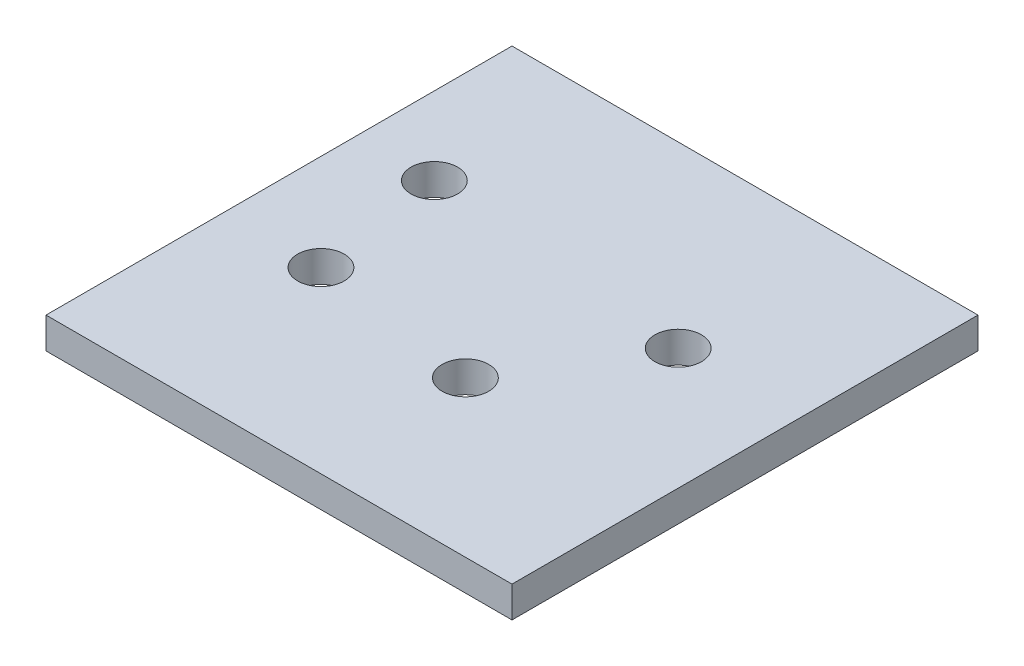
ISO-10303-21;
HEADER;
FILE_DESCRIPTION(('STEP AP214'),'2;1');
FILE_NAME('part.step','',(''),(''),'','','');
FILE_SCHEMA(('AUTOMOTIVE_DESIGN { 1 0 10303 214 1 1 1 1 }'));
ENDSEC;
DATA;
#1=APPLICATION_CONTEXT('core data for automotive mechanical design processes');
#2=APPLICATION_PROTOCOL_DEFINITION('international standard','automotive_design',2000,#1);
#3=PRODUCT_CONTEXT('',#1,'mechanical');
#4=PRODUCT('Part','Part','',(#3));
#5=PRODUCT_RELATED_PRODUCT_CATEGORY('part','',(#4));
#6=PRODUCT_DEFINITION_FORMATION('','',#4);
#7=PRODUCT_DEFINITION_CONTEXT('part definition',#1,'design');
#8=PRODUCT_DEFINITION('design','',#6,#7);
#9=PRODUCT_DEFINITION_SHAPE('','',#8);
#10=(LENGTH_UNIT() NAMED_UNIT(*) SI_UNIT(.MILLI.,.METRE.));
#11=(NAMED_UNIT(*) PLANE_ANGLE_UNIT() SI_UNIT($,.RADIAN.));
#12=(NAMED_UNIT(*) SI_UNIT($,.STERADIAN.) SOLID_ANGLE_UNIT());
#13=UNCERTAINTY_MEASURE_WITH_UNIT(LENGTH_MEASURE(1.E-05),#10,'distance_accuracy_value','');
#14=(GEOMETRIC_REPRESENTATION_CONTEXT(3) GLOBAL_UNCERTAINTY_ASSIGNED_CONTEXT((#13)) GLOBAL_UNIT_ASSIGNED_CONTEXT((#10,
#11,#12)) REPRESENTATION_CONTEXT('',''));
#15=CARTESIAN_POINT('',(0.,0.,0.));
#16=DIRECTION('',(0.,0.,1.));
#17=DIRECTION('',(1.,0.,0.));
#18=AXIS2_PLACEMENT_3D('',#15,#16,#17);
#19=CARTESIAN_POINT('',(0.,2.,0.));
#20=DIRECTION('',(0.,1.,0.));
#21=DIRECTION('',(0.,0.,1.));
#22=AXIS2_PLACEMENT_3D('',#19,#20,#21);
#23=PLANE('',#22);
#24=CARTESIAN_POINT('',(-18.6292997644175,2.,-7.47838875078331));
#25=DIRECTION('',(0.,1.,0.));
#26=DIRECTION('',(0.,0.,1.));
#27=AXIS2_PLACEMENT_3D('',#24,#25,#26);
#28=CIRCLE('',#27,1.5);
#29=CARTESIAN_POINT('',(-18.6292997644175,2.,-5.9783887507833));
#30=VERTEX_POINT('',#29);
#31=EDGE_CURVE('E123',#30,#30,#28,.T.);
#32=ORIENTED_EDGE('',*,*,#31,.F.);
#33=EDGE_LOOP('',(#32));
#34=FACE_BOUND('',#33,.T.);
#35=CARTESIAN_POINT('',(-1.4292997644175,2.,-5.9783887507833));
#36=DIRECTION('',(0.,1.,0.));
#37=DIRECTION('',(0.,0.,1.));
#38=AXIS2_PLACEMENT_3D('',#35,#36,#37);
#39=CIRCLE('',#38,1.5);
#40=CARTESIAN_POINT('',(-1.4292997644175,2.,-4.4783887507833));
#41=VERTEX_POINT('',#40);
#42=EDGE_CURVE('E120',#41,#41,#39,.T.);
#43=ORIENTED_EDGE('',*,*,#42,.F.);
#44=EDGE_LOOP('',(#43));
#45=FACE_BOUND('',#44,.T.);
#46=DIRECTION('',(0.,0.,1.));
#47=VECTOR('',#46,1.);
#48=CARTESIAN_POINT('',(6.3707002355825,2.,0.));
#49=LINE('',#48,#47);
#50=CARTESIAN_POINT('',(6.3707002355825,2.,-17.4783887507833));
#51=VERTEX_POINT('',#50);
#52=CARTESIAN_POINT('',(6.3707002355825,2.,12.5216112492167));
#53=VERTEX_POINT('',#52);
#54=EDGE_CURVE('E113',#51,#53,#49,.T.);
#55=ORIENTED_EDGE('',*,*,#54,.F.);
#56=DIRECTION('',(1.,0.,0.));
#57=VECTOR('',#56,1.);
#58=CARTESIAN_POINT('',(0.,2.,-17.4783887507833));
#59=LINE('',#58,#57);
#60=CARTESIAN_POINT('',(-23.6292997644175,2.,-17.4783887507833));
#61=VERTEX_POINT('',#60);
#62=EDGE_CURVE('E102',#61,#51,#59,.T.);
#63=ORIENTED_EDGE('',*,*,#62,.F.);
#64=DIRECTION('',(0.,0.,1.));
#65=VECTOR('',#64,1.);
#66=CARTESIAN_POINT('',(-23.6292997644175,2.,0.));
#67=LINE('',#66,#65);
#68=CARTESIAN_POINT('',(-23.6292997644175,2.,12.5216112492167));
#69=VERTEX_POINT('',#68);
#70=EDGE_CURVE('E109',#61,#69,#67,.T.);
#71=ORIENTED_EDGE('',*,*,#70,.T.);
#72=DIRECTION('',(1.,0.,0.));
#73=VECTOR('',#72,1.);
#74=CARTESIAN_POINT('',(0.,2.,12.5216112492167));
#75=LINE('',#74,#73);
#76=EDGE_CURVE('E69',#69,#53,#75,.T.);
#77=ORIENTED_EDGE('',*,*,#76,.T.);
#78=EDGE_LOOP('',(#55,#63,#71,#77));
#79=FACE_BOUND('',#78,.T.);
#80=CARTESIAN_POINT('',(-6.6292997644175,2.,2.52161124921669));
#81=DIRECTION('',(0.,1.,0.));
#82=DIRECTION('',(0.,0.,1.));
#83=AXIS2_PLACEMENT_3D('',#80,#81,#82);
#84=CIRCLE('',#83,1.5);
#85=CARTESIAN_POINT('',(-6.6292997644175,2.,4.0216112492167));
#86=VERTEX_POINT('',#85);
#87=EDGE_CURVE('E115',#86,#86,#84,.T.);
#88=ORIENTED_EDGE('',*,*,#87,.F.);
#89=EDGE_LOOP('',(#88));
#90=FACE_BOUND('',#89,.T.);
#91=CARTESIAN_POINT('',(-17.4292997644175,2.,1.02161124921669));
#92=DIRECTION('',(0.,1.,0.));
#93=DIRECTION('',(0.,0.,1.));
#94=AXIS2_PLACEMENT_3D('',#91,#92,#93);
#95=CIRCLE('',#94,1.5);
#96=CARTESIAN_POINT('',(-17.4292997644175,2.,2.5216112492167));
#97=VERTEX_POINT('',#96);
#98=EDGE_CURVE('E130',#97,#97,#95,.T.);
#99=ORIENTED_EDGE('',*,*,#98,.F.);
#100=EDGE_LOOP('',(#99));
#101=FACE_BOUND('',#100,.T.);
#102=ADVANCED_FACE('F52',(#34,#45,#79,#90,#101),#23,.T.);
#103=CARTESIAN_POINT('',(0.,0.,0.));
#104=DIRECTION('',(0.,1.,0.));
#105=DIRECTION('',(0.,0.,1.));
#106=AXIS2_PLACEMENT_3D('',#103,#104,#105);
#107=PLANE('',#106);
#108=CARTESIAN_POINT('',(-6.6292997644175,0.,2.52161124921669));
#109=DIRECTION('',(0.,1.,0.));
#110=DIRECTION('',(0.,0.,1.));
#111=AXIS2_PLACEMENT_3D('',#108,#109,#110);
#112=CIRCLE('',#111,1.5);
#113=CARTESIAN_POINT('',(-6.6292997644175,0.,4.0216112492167));
#114=VERTEX_POINT('',#113);
#115=EDGE_CURVE('E126',#114,#114,#112,.T.);
#116=ORIENTED_EDGE('',*,*,#115,.T.);
#117=EDGE_LOOP('',(#116));
#118=FACE_BOUND('',#117,.T.);
#119=DIRECTION('',(0.,0.,1.));
#120=VECTOR('',#119,1.);
#121=CARTESIAN_POINT('',(6.3707002355825,0.,0.));
#122=LINE('',#121,#120);
#123=CARTESIAN_POINT('',(6.3707002355825,0.,-17.4783887507833));
#124=VERTEX_POINT('',#123);
#125=CARTESIAN_POINT('',(6.3707002355825,0.,12.5216112492167));
#126=VERTEX_POINT('',#125);
#127=EDGE_CURVE('E129',#124,#126,#122,.T.);
#128=ORIENTED_EDGE('',*,*,#127,.T.);
#129=DIRECTION('',(1.,0.,0.));
#130=VECTOR('',#129,1.);
#131=CARTESIAN_POINT('',(0.,0.,12.5216112492167));
#132=LINE('',#131,#130);
#133=CARTESIAN_POINT('',(-23.6292997644175,0.,12.5216112492167));
#134=VERTEX_POINT('',#133);
#135=EDGE_CURVE('E85',#134,#126,#132,.T.);
#136=ORIENTED_EDGE('',*,*,#135,.F.);
#137=DIRECTION('',(0.,0.,1.));
#138=VECTOR('',#137,1.);
#139=CARTESIAN_POINT('',(-23.6292997644175,0.,0.));
#140=LINE('',#139,#138);
#141=CARTESIAN_POINT('',(-23.6292997644175,0.,-17.4783887507833));
#142=VERTEX_POINT('',#141);
#143=EDGE_CURVE('E133',#142,#134,#140,.T.);
#144=ORIENTED_EDGE('',*,*,#143,.F.);
#145=DIRECTION('',(1.,0.,0.));
#146=VECTOR('',#145,1.);
#147=CARTESIAN_POINT('',(0.,0.,-17.4783887507833));
#148=LINE('',#147,#146);
#149=EDGE_CURVE('E104',#142,#124,#148,.T.);
#150=ORIENTED_EDGE('',*,*,#149,.T.);
#151=EDGE_LOOP('',(#128,#136,#144,#150));
#152=FACE_BOUND('',#151,.T.);
#153=CARTESIAN_POINT('',(-1.4292997644175,0.,-5.9783887507833));
#154=DIRECTION('',(0.,1.,0.));
#155=DIRECTION('',(0.,0.,1.));
#156=AXIS2_PLACEMENT_3D('',#153,#154,#155);
#157=CIRCLE('',#156,1.5);
#158=CARTESIAN_POINT('',(-1.4292997644175,0.,-4.4783887507833));
#159=VERTEX_POINT('',#158);
#160=EDGE_CURVE('E136',#159,#159,#157,.T.);
#161=ORIENTED_EDGE('',*,*,#160,.T.);
#162=EDGE_LOOP('',(#161));
#163=FACE_BOUND('',#162,.T.);
#164=CARTESIAN_POINT('',(-18.6292997644175,0.,-7.47838875078331));
#165=DIRECTION('',(0.,1.,0.));
#166=DIRECTION('',(0.,0.,1.));
#167=AXIS2_PLACEMENT_3D('',#164,#165,#166);
#168=CIRCLE('',#167,1.5);
#169=CARTESIAN_POINT('',(-18.6292997644175,0.,-5.9783887507833));
#170=VERTEX_POINT('',#169);
#171=EDGE_CURVE('E139',#170,#170,#168,.T.);
#172=ORIENTED_EDGE('',*,*,#171,.T.);
#173=EDGE_LOOP('',(#172));
#174=FACE_BOUND('',#173,.T.);
#175=CARTESIAN_POINT('',(-17.4292997644175,0.,1.02161124921669));
#176=DIRECTION('',(0.,1.,0.));
#177=DIRECTION('',(0.,0.,1.));
#178=AXIS2_PLACEMENT_3D('',#175,#176,#177);
#179=CIRCLE('',#178,1.5);
#180=CARTESIAN_POINT('',(-17.4292997644175,0.,2.5216112492167));
#181=VERTEX_POINT('',#180);
#182=EDGE_CURVE('E248',#181,#181,#179,.T.);
#183=ORIENTED_EDGE('',*,*,#182,.T.);
#184=EDGE_LOOP('',(#183));
#185=FACE_BOUND('',#184,.T.);
#186=ADVANCED_FACE('F145',(#118,#152,#163,#174,#185),#107,.F.);
#187=CARTESIAN_POINT('',(6.3707002355825,2.,0.));
#188=DIRECTION('',(1.,0.,0.));
#189=DIRECTION('',(0.,0.,-1.));
#190=AXIS2_PLACEMENT_3D('',#187,#188,#189);
#191=PLANE('',#190);
#192=ORIENTED_EDGE('',*,*,#127,.F.);
#193=DIRECTION('',(0.,-1.,0.));
#194=VECTOR('',#193,1.);
#195=CARTESIAN_POINT('',(6.3707002355825,2.,-17.4783887507833));
#196=LINE('',#195,#194);
#197=EDGE_CURVE('E12',#51,#124,#196,.T.);
#198=ORIENTED_EDGE('',*,*,#197,.F.);
#199=ORIENTED_EDGE('',*,*,#54,.T.);
#200=DIRECTION('',(0.,-1.,0.));
#201=VECTOR('',#200,1.);
#202=CARTESIAN_POINT('',(6.3707002355825,2.,12.5216112492167));
#203=LINE('',#202,#201);
#204=EDGE_CURVE('E92',#53,#126,#203,.T.);
#205=ORIENTED_EDGE('',*,*,#204,.T.);
#206=EDGE_LOOP('',(#192,#198,#199,#205));
#207=FACE_BOUND('',#206,.T.);
#208=ADVANCED_FACE('F147',(#207),#191,.T.);
#209=CARTESIAN_POINT('',(0.,2.,-17.4783887507833));
#210=DIRECTION('',(0.,0.,-1.));
#211=DIRECTION('',(-1.,0.,0.));
#212=AXIS2_PLACEMENT_3D('',#209,#210,#211);
#213=PLANE('',#212);
#214=ORIENTED_EDGE('',*,*,#149,.F.);
#215=DIRECTION('',(0.,-1.,0.));
#216=VECTOR('',#215,1.);
#217=CARTESIAN_POINT('',(-23.6292997644175,2.,-17.4783887507833));
#218=LINE('',#217,#216);
#219=EDGE_CURVE('E61',#61,#142,#218,.T.);
#220=ORIENTED_EDGE('',*,*,#219,.F.);
#221=ORIENTED_EDGE('',*,*,#62,.T.);
#222=ORIENTED_EDGE('',*,*,#197,.T.);
#223=EDGE_LOOP('',(#214,#220,#221,#222));
#224=FACE_BOUND('',#223,.T.);
#225=ADVANCED_FACE('F100',(#224),#213,.T.);
#226=CARTESIAN_POINT('',(-23.6292997644175,2.,0.));
#227=DIRECTION('',(1.,0.,0.));
#228=DIRECTION('',(0.,0.,-1.));
#229=AXIS2_PLACEMENT_3D('',#226,#227,#228);
#230=PLANE('',#229);
#231=ORIENTED_EDGE('',*,*,#143,.T.);
#232=DIRECTION('',(0.,-1.,0.));
#233=VECTOR('',#232,1.);
#234=CARTESIAN_POINT('',(-23.6292997644175,2.,12.5216112492167));
#235=LINE('',#234,#233);
#236=EDGE_CURVE('E107',#69,#134,#235,.T.);
#237=ORIENTED_EDGE('',*,*,#236,.F.);
#238=ORIENTED_EDGE('',*,*,#70,.F.);
#239=ORIENTED_EDGE('',*,*,#219,.T.);
#240=EDGE_LOOP('',(#231,#237,#238,#239));
#241=FACE_BOUND('',#240,.T.);
#242=ADVANCED_FACE('F110',(#241),#230,.F.);
#243=CARTESIAN_POINT('',(-1.4292997644175,2.,-5.9783887507833));
#244=DIRECTION('',(0.,-1.,0.));
#245=DIRECTION('',(0.,0.,-1.));
#246=AXIS2_PLACEMENT_3D('',#243,#244,#245);
#247=CYLINDRICAL_SURFACE('',#246,1.5);
#248=ORIENTED_EDGE('',*,*,#42,.T.);
#249=EDGE_LOOP('',(#248));
#250=FACE_BOUND('',#249,.T.);
#251=ORIENTED_EDGE('',*,*,#160,.F.);
#252=EDGE_LOOP('',(#251));
#253=FACE_BOUND('',#252,.T.);
#254=ADVANCED_FACE('F170',(#250,#253),#247,.F.);
#255=CARTESIAN_POINT('',(0.,2.,12.5216112492167));
#256=DIRECTION('',(0.,0.,-1.));
#257=DIRECTION('',(-1.,0.,0.));
#258=AXIS2_PLACEMENT_3D('',#255,#256,#257);
#259=PLANE('',#258);
#260=ORIENTED_EDGE('',*,*,#135,.T.);
#261=ORIENTED_EDGE('',*,*,#204,.F.);
#262=ORIENTED_EDGE('',*,*,#76,.F.);
#263=ORIENTED_EDGE('',*,*,#236,.T.);
#264=EDGE_LOOP('',(#260,#261,#262,#263));
#265=FACE_BOUND('',#264,.T.);
#266=ADVANCED_FACE('F144',(#265),#259,.F.);
#267=CARTESIAN_POINT('',(-6.6292997644175,2.,2.52161124921669));
#268=DIRECTION('',(0.,-1.,0.));
#269=DIRECTION('',(0.,0.,-1.));
#270=AXIS2_PLACEMENT_3D('',#267,#268,#269);
#271=CYLINDRICAL_SURFACE('',#270,1.5);
#272=ORIENTED_EDGE('',*,*,#87,.T.);
#273=EDGE_LOOP('',(#272));
#274=FACE_BOUND('',#273,.T.);
#275=ORIENTED_EDGE('',*,*,#115,.F.);
#276=EDGE_LOOP('',(#275));
#277=FACE_BOUND('',#276,.T.);
#278=ADVANCED_FACE('F54',(#274,#277),#271,.F.);
#279=CARTESIAN_POINT('',(-18.6292997644175,2.,-7.47838875078331));
#280=DIRECTION('',(0.,-1.,0.));
#281=DIRECTION('',(0.,0.,-1.));
#282=AXIS2_PLACEMENT_3D('',#279,#280,#281);
#283=CYLINDRICAL_SURFACE('',#282,1.5);
#284=ORIENTED_EDGE('',*,*,#31,.T.);
#285=EDGE_LOOP('',(#284));
#286=FACE_BOUND('',#285,.T.);
#287=ORIENTED_EDGE('',*,*,#171,.F.);
#288=EDGE_LOOP('',(#287));
#289=FACE_BOUND('',#288,.T.);
#290=ADVANCED_FACE('F166',(#286,#289),#283,.F.);
#291=CARTESIAN_POINT('',(-17.4292997644175,2.,1.02161124921669));
#292=DIRECTION('',(0.,-1.,0.));
#293=DIRECTION('',(0.,0.,-1.));
#294=AXIS2_PLACEMENT_3D('',#291,#292,#293);
#295=CYLINDRICAL_SURFACE('',#294,1.5);
#296=ORIENTED_EDGE('',*,*,#98,.T.);
#297=EDGE_LOOP('',(#296));
#298=FACE_BOUND('',#297,.T.);
#299=ORIENTED_EDGE('',*,*,#182,.F.);
#300=EDGE_LOOP('',(#299));
#301=FACE_BOUND('',#300,.T.);
#302=ADVANCED_FACE('F164',(#298,#301),#295,.F.);
#303=CLOSED_SHELL('',(#102,#186,#208,#225,#242,#254,#266,#278,#290,#302));
#304=MANIFOLD_SOLID_BREP('B2',#303);
#305=ADVANCED_BREP_SHAPE_REPRESENTATION('',(#18,#304),#14);
#306=SHAPE_DEFINITION_REPRESENTATION(#9,#305);
ENDSEC;
END-ISO-10303-21;
